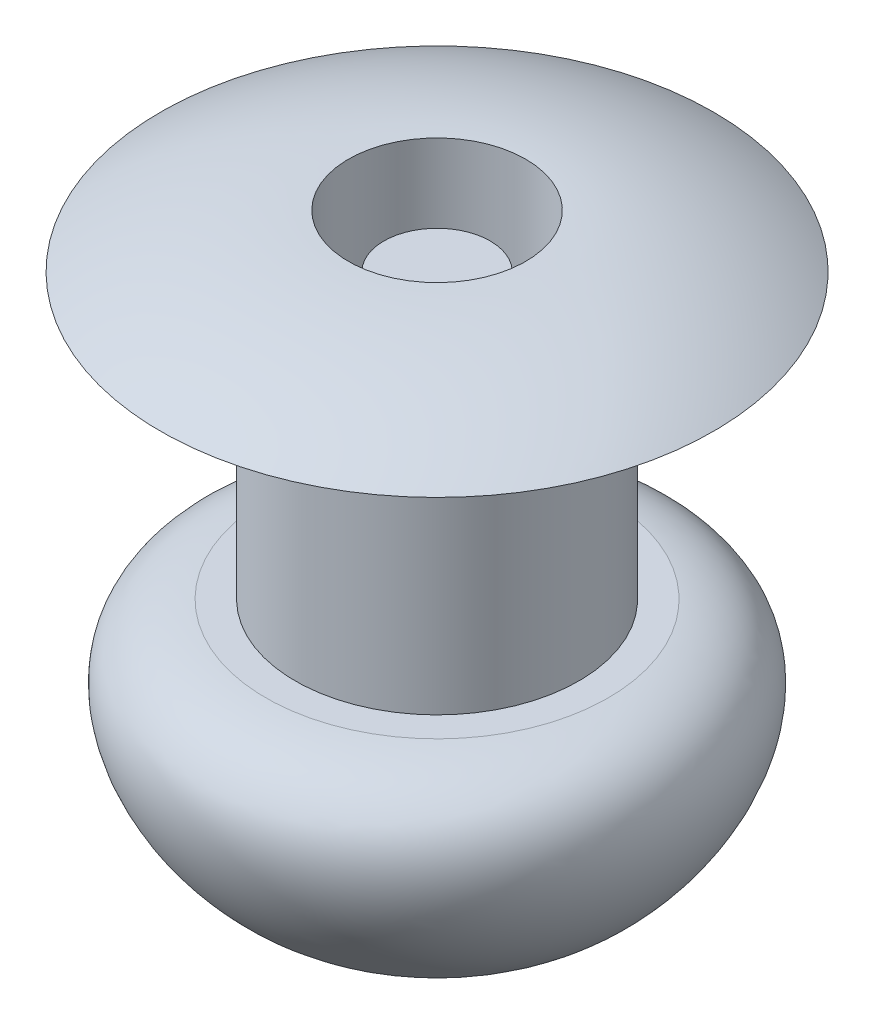
ISO-10303-21;
HEADER;
FILE_DESCRIPTION(('STEP AP214'),'2;1');
FILE_NAME('part.step','',(''),(''),'','','');
FILE_SCHEMA(('AUTOMOTIVE_DESIGN { 1 0 10303 214 1 1 1 1 }'));
ENDSEC;
DATA;
#1=APPLICATION_CONTEXT('core data for automotive mechanical design processes');
#2=APPLICATION_PROTOCOL_DEFINITION('international standard','automotive_design',2000,#1);
#3=PRODUCT_CONTEXT('',#1,'mechanical');
#4=PRODUCT('Part','Part','',(#3));
#5=PRODUCT_RELATED_PRODUCT_CATEGORY('part','',(#4));
#6=PRODUCT_DEFINITION_FORMATION('','',#4);
#7=PRODUCT_DEFINITION_CONTEXT('part definition',#1,'design');
#8=PRODUCT_DEFINITION('design','',#6,#7);
#9=PRODUCT_DEFINITION_SHAPE('','',#8);
#10=(LENGTH_UNIT() NAMED_UNIT(*) SI_UNIT(.MILLI.,.METRE.));
#11=(NAMED_UNIT(*) PLANE_ANGLE_UNIT() SI_UNIT($,.RADIAN.));
#12=(NAMED_UNIT(*) SI_UNIT($,.STERADIAN.) SOLID_ANGLE_UNIT());
#13=UNCERTAINTY_MEASURE_WITH_UNIT(LENGTH_MEASURE(1.E-05),#10,'distance_accuracy_value','');
#14=(GEOMETRIC_REPRESENTATION_CONTEXT(3) GLOBAL_UNCERTAINTY_ASSIGNED_CONTEXT((#13)) GLOBAL_UNIT_ASSIGNED_CONTEXT((#10,
#11,#12)) REPRESENTATION_CONTEXT('',''));
#15=CARTESIAN_POINT('',(0.,0.,0.));
#16=DIRECTION('',(0.,0.,1.));
#17=DIRECTION('',(1.,0.,0.));
#18=AXIS2_PLACEMENT_3D('',#15,#16,#17);
#19=CARTESIAN_POINT('',(0.,0.,0.));
#20=DIRECTION('',(0.,-1.,0.));
#21=DIRECTION('',(0.,0.,-1.));
#22=AXIS2_PLACEMENT_3D('',#19,#20,#21);
#23=PLANE('',#22);
#24=CARTESIAN_POINT('',(0.,0.,0.));
#25=DIRECTION('',(0.,-1.,0.));
#26=DIRECTION('',(0.,0.,-1.));
#27=AXIS2_PLACEMENT_3D('',#24,#25,#26);
#28=CIRCLE('',#27,0.75);
#29=CARTESIAN_POINT('',(0.,0.,-0.75));
#30=VERTEX_POINT('',#29);
#31=EDGE_CURVE('E11',#30,#30,#28,.T.);
#32=ORIENTED_EDGE('',*,*,#31,.F.);
#33=EDGE_LOOP('',(#32));
#34=FACE_BOUND('',#33,.T.);
#35=ADVANCED_FACE('F35',(#34),#23,.F.);
#36=CARTESIAN_POINT('',(0.,0.,0.));
#37=DIRECTION('',(0.,-1.,0.));
#38=DIRECTION('',(0.,0.,-1.));
#39=AXIS2_PLACEMENT_3D('',#36,#37,#38);
#40=CYLINDRICAL_SURFACE('',#39,0.75);
#41=CARTESIAN_POINT('',(0.,-4.20073852298997,0.));
#42=DIRECTION('',(0.,-1.,0.));
#43=DIRECTION('',(0.,0.,-1.));
#44=AXIS2_PLACEMENT_3D('',#41,#42,#43);
#45=CIRCLE('',#44,0.749999999999999);
#46=CARTESIAN_POINT('',(0.,-4.20073852298997,-0.749999999999999));
#47=VERTEX_POINT('',#46);
#48=EDGE_CURVE('E41',#47,#47,#45,.T.);
#49=ORIENTED_EDGE('',*,*,#48,.F.);
#50=EDGE_LOOP('',(#49));
#51=FACE_BOUND('',#50,.T.);
#52=ORIENTED_EDGE('',*,*,#31,.T.);
#53=EDGE_LOOP('',(#52));
#54=FACE_BOUND('',#53,.T.);
#55=ADVANCED_FACE('F80',(#51,#54),#40,.T.);
#56=CARTESIAN_POINT('',(0.,-4.20073852298997,0.749999999999999));
#57=DIRECTION('',(0.,-1.,0.));
#58=DIRECTION('',(0.,0.,-1.));
#59=AXIS2_PLACEMENT_3D('',#56,#57,#58);
#60=PLANE('',#59);
#61=CARTESIAN_POINT('',(0.,-4.20073852298997,0.));
#62=DIRECTION('',(0.,-1.,0.));
#63=DIRECTION('',(0.,0.,-1.));
#64=AXIS2_PLACEMENT_3D('',#61,#62,#63);
#65=CIRCLE('',#64,1.25);
#66=CARTESIAN_POINT('',(0.,-4.20073852298997,-1.25));
#67=VERTEX_POINT('',#66);
#68=EDGE_CURVE('E73',#67,#67,#65,.T.);
#69=ORIENTED_EDGE('',*,*,#68,.F.);
#70=EDGE_LOOP('',(#69));
#71=FACE_BOUND('',#70,.T.);
#72=ORIENTED_EDGE('',*,*,#48,.T.);
#73=EDGE_LOOP('',(#72));
#74=FACE_BOUND('',#73,.T.);
#75=ADVANCED_FACE('F78',(#71,#74),#60,.F.);
#76=CARTESIAN_POINT('',(0.,0.,0.));
#77=DIRECTION('',(0.,-1.,0.));
#78=DIRECTION('',(0.,0.,-1.));
#79=AXIS2_PLACEMENT_3D('',#76,#77,#78);
#80=CYLINDRICAL_SURFACE('',#79,1.25);
#81=CARTESIAN_POINT('',(0.,0.75,0.));
#82=DIRECTION('',(0.,-1.,0.));
#83=DIRECTION('',(0.,0.,-1.));
#84=AXIS2_PLACEMENT_3D('',#81,#82,#83);
#85=CIRCLE('',#84,1.25);
#86=CARTESIAN_POINT('',(0.,0.75,-1.25));
#87=VERTEX_POINT('',#86);
#88=EDGE_CURVE('E70',#87,#87,#85,.T.);
#89=ORIENTED_EDGE('',*,*,#88,.F.);
#90=EDGE_LOOP('',(#89));
#91=FACE_BOUND('',#90,.T.);
#92=ORIENTED_EDGE('',*,*,#68,.T.);
#93=EDGE_LOOP('',(#92));
#94=FACE_BOUND('',#93,.T.);
#95=ADVANCED_FACE('F98',(#91,#94),#80,.F.);
#96=CARTESIAN_POINT('',(0.,-4.30666666666667,0.));
#97=DIRECTION('',(0.,-1.,0.));
#98=DIRECTION('',(0.,0.,-1.));
#99=AXIS2_PLACEMENT_3D('',#96,#97,#98);
#100=DEGENERATE_TOROIDAL_SURFACE('',#99,1.25,5.05666666666667,.T.);
#101=CARTESIAN_POINT('',(0.,0.,0.));
#102=DIRECTION('',(0.,-1.,0.));
#103=DIRECTION('',(0.,0.,-1.));
#104=AXIS2_PLACEMENT_3D('',#101,#102,#103);
#105=CIRCLE('',#104,3.9);
#106=CARTESIAN_POINT('',(0.,0.,-3.9));
#107=VERTEX_POINT('',#106);
#108=EDGE_CURVE('E67',#107,#107,#105,.T.);
#109=ORIENTED_EDGE('',*,*,#108,.F.);
#110=EDGE_LOOP('',(#109));
#111=FACE_BOUND('',#110,.T.);
#112=ORIENTED_EDGE('',*,*,#88,.T.);
#113=EDGE_LOOP('',(#112));
#114=FACE_BOUND('',#113,.T.);
#115=ADVANCED_FACE('F106',(#111,#114),#100,.T.);
#116=CARTESIAN_POINT('',(0.,0.,3.9));
#117=DIRECTION('',(0.,1.,0.));
#118=DIRECTION('',(0.,0.,1.));
#119=AXIS2_PLACEMENT_3D('',#116,#117,#118);
#120=PLANE('',#119);
#121=CARTESIAN_POINT('',(0.,0.,0.));
#122=DIRECTION('',(0.,-1.,0.));
#123=DIRECTION('',(0.,0.,-1.));
#124=AXIS2_PLACEMENT_3D('',#121,#122,#123);
#125=CIRCLE('',#124,2.);
#126=CARTESIAN_POINT('',(0.,0.,-2.));
#127=VERTEX_POINT('',#126);
#128=EDGE_CURVE('E64',#127,#127,#125,.T.);
#129=ORIENTED_EDGE('',*,*,#128,.F.);
#130=EDGE_LOOP('',(#129));
#131=FACE_BOUND('',#130,.T.);
#132=ORIENTED_EDGE('',*,*,#108,.T.);
#133=EDGE_LOOP('',(#132));
#134=FACE_BOUND('',#133,.T.);
#135=ADVANCED_FACE('F114',(#131,#134),#120,.F.);
#136=CARTESIAN_POINT('',(0.,0.,0.));
#137=DIRECTION('',(0.,-1.,0.));
#138=DIRECTION('',(0.,0.,-1.));
#139=AXIS2_PLACEMENT_3D('',#136,#137,#138);
#140=CYLINDRICAL_SURFACE('',#139,2.);
#141=CARTESIAN_POINT('',(0.,-4.,0.));
#142=DIRECTION('',(0.,-1.,0.));
#143=DIRECTION('',(0.,0.,-1.));
#144=AXIS2_PLACEMENT_3D('',#141,#142,#143);
#145=CIRCLE('',#144,2.);
#146=CARTESIAN_POINT('',(0.,-4.,-2.));
#147=VERTEX_POINT('',#146);
#148=EDGE_CURVE('E56',#147,#147,#145,.T.);
#149=ORIENTED_EDGE('',*,*,#148,.F.);
#150=EDGE_LOOP('',(#149));
#151=FACE_BOUND('',#150,.T.);
#152=ORIENTED_EDGE('',*,*,#128,.T.);
#153=EDGE_LOOP('',(#152));
#154=FACE_BOUND('',#153,.T.);
#155=ADVANCED_FACE('F122',(#151,#154),#140,.T.);
#156=CARTESIAN_POINT('',(0.,-4.,2.));
#157=DIRECTION('',(0.,-1.,0.));
#158=DIRECTION('',(0.,0.,-1.));
#159=AXIS2_PLACEMENT_3D('',#156,#157,#158);
#160=PLANE('',#159);
#161=CARTESIAN_POINT('',(0.,-4.,0.));
#162=DIRECTION('',(0.,-1.,0.));
#163=DIRECTION('',(0.,0.,-1.));
#164=AXIS2_PLACEMENT_3D('',#161,#162,#163);
#165=CIRCLE('',#164,2.4138917546613);
#166=CARTESIAN_POINT('',(0.,-4.,-2.4138917546613));
#167=VERTEX_POINT('',#166);
#168=EDGE_CURVE('E53',#167,#167,#165,.T.);
#169=ORIENTED_EDGE('',*,*,#168,.F.);
#170=EDGE_LOOP('',(#169));
#171=FACE_BOUND('',#170,.T.);
#172=ORIENTED_EDGE('',*,*,#148,.T.);
#173=EDGE_LOOP('',(#172));
#174=FACE_BOUND('',#173,.T.);
#175=ADVANCED_FACE('F130',(#171,#174),#160,.F.);
#176=CARTESIAN_POINT('',(0.,-4.,2.4138917546613));
#177=CARTESIAN_POINT('',(0.,-4.16965732172857,3.86750311174021));
#178=CARTESIAN_POINT('',(0.,-6.30201362643837,3.52887764908681));
#179=CARTESIAN_POINT('',(0.,-7.87353236883243,1.08396164238539));
#180=CARTESIAN_POINT('',(0.,-5.87494929761665,0.271752617549607));
#181=CARTESIAN_POINT('',(0.,-5.57892919358065,0.956030426512504));
#182=B_SPLINE_CURVE_WITH_KNOTS('',3,(#176,#177,#178,#179,#180,#181),.UNSPECIFIED.,.F.,.F.,(4,1,
1,4),(0.,0.464993081764921,0.721927552661067,1.),.UNSPECIFIED.);
#183=CARTESIAN_POINT('',(0.,0.,0.));
#184=DIRECTION('',(0.,-1.,0.));
#185=AXIS1_PLACEMENT('',#183,#184);
#186=SURFACE_OF_REVOLUTION('',#182,#185);
#187=CARTESIAN_POINT('',(0.,-5.57892919358065,0.));
#188=DIRECTION('',(0.,-1.,0.));
#189=DIRECTION('',(0.,0.,-1.));
#190=AXIS2_PLACEMENT_3D('',#187,#188,#189);
#191=CIRCLE('',#190,0.956030426512504);
#192=CARTESIAN_POINT('',(0.,-5.57892919358065,-0.956030426512504));
#193=VERTEX_POINT('',#192);
#194=EDGE_CURVE('E51',#193,#193,#191,.T.);
#195=ORIENTED_EDGE('',*,*,#194,.F.);
#196=EDGE_LOOP('',(#195));
#197=FACE_BOUND('',#196,.T.);
#198=ORIENTED_EDGE('',*,*,#168,.T.);
#199=EDGE_LOOP('',(#198));
#200=FACE_BOUND('',#199,.T.);
#201=ADVANCED_FACE('F47',(#197,#200),#186,.T.);
#202=CARTESIAN_POINT('',(0.,-4.95073852298997,0.));
#203=DIRECTION('',(1.,0.,0.));
#204=DIRECTION('',(0.,0.,1.));
#205=AXIS2_PLACEMENT_3D('',#202,#203,#204);
#206=ELLIPSE('',#205,1.75,0.75);
#207=TRIMMED_CURVE('',#206,(PARAMETER_VALUE(-1.5707963267949)),
(PARAMETER_VALUE(1.5707963267949)),.T.,.PARAMETER.);
#208=CARTESIAN_POINT('',(0.,0.,0.));
#209=DIRECTION('',(0.,-1.,0.));
#210=AXIS1_PLACEMENT('',#208,#209);
#211=SURFACE_OF_REVOLUTION('',#207,#210);
#212=CARTESIAN_POINT('',(0.,-5.70073852298997,0.));
#213=VERTEX_POINT('',#212);
#214=VERTEX_LOOP('',#213);
#215=FACE_BOUND('',#214,.T.);
#216=ORIENTED_EDGE('',*,*,#194,.T.);
#217=EDGE_LOOP('',(#216));
#218=FACE_BOUND('',#217,.T.);
#219=ADVANCED_FACE('F44',(#215,#218),#211,.T.);
#220=CLOSED_SHELL('',(#35,#55,#75,#95,#115,#135,#155,#175,#201,#219));
#221=MANIFOLD_SOLID_BREP('B2',#220);
#222=ADVANCED_BREP_SHAPE_REPRESENTATION('',(#18,#221),#14);
#223=SHAPE_DEFINITION_REPRESENTATION(#9,#222);
ENDSEC;
END-ISO-10303-21;
